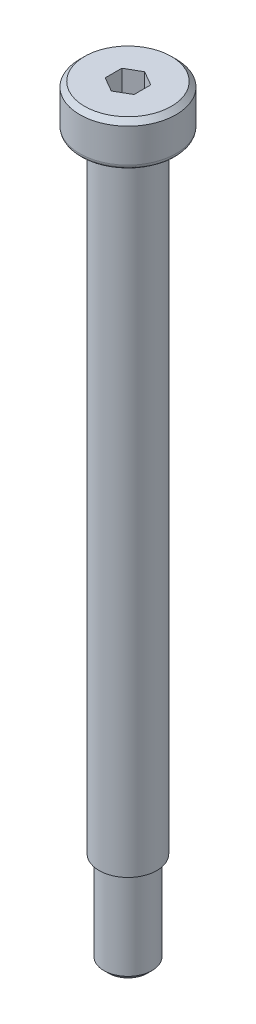
ISO-10303-21;
HEADER;
FILE_DESCRIPTION(('STEP AP214'),'2;1');
FILE_NAME('part.step','',(''),(''),'','','');
FILE_SCHEMA(('AUTOMOTIVE_DESIGN { 1 0 10303 214 1 1 1 1 }'));
ENDSEC;
DATA;
#1=APPLICATION_CONTEXT('core data for automotive mechanical design processes');
#2=APPLICATION_PROTOCOL_DEFINITION('international standard','automotive_design',2000,#1);
#3=PRODUCT_CONTEXT('',#1,'mechanical');
#4=PRODUCT('Part','Part','',(#3));
#5=PRODUCT_RELATED_PRODUCT_CATEGORY('part','',(#4));
#6=PRODUCT_DEFINITION_FORMATION('','',#4);
#7=PRODUCT_DEFINITION_CONTEXT('part definition',#1,'design');
#8=PRODUCT_DEFINITION('design','',#6,#7);
#9=PRODUCT_DEFINITION_SHAPE('','',#8);
#10=(LENGTH_UNIT() NAMED_UNIT(*) SI_UNIT(.MILLI.,.METRE.));
#11=(NAMED_UNIT(*) PLANE_ANGLE_UNIT() SI_UNIT($,.RADIAN.));
#12=(NAMED_UNIT(*) SI_UNIT($,.STERADIAN.) SOLID_ANGLE_UNIT());
#13=UNCERTAINTY_MEASURE_WITH_UNIT(LENGTH_MEASURE(1.E-05),#10,'distance_accuracy_value','');
#14=(GEOMETRIC_REPRESENTATION_CONTEXT(3) GLOBAL_UNCERTAINTY_ASSIGNED_CONTEXT((#13)) GLOBAL_UNIT_ASSIGNED_CONTEXT((#10,
#11,#12)) REPRESENTATION_CONTEXT('',''));
#15=CARTESIAN_POINT('',(0.,0.,0.));
#16=DIRECTION('',(0.,0.,1.));
#17=DIRECTION('',(1.,0.,0.));
#18=AXIS2_PLACEMENT_3D('',#15,#16,#17);
#19=CARTESIAN_POINT('',(0.,0.,0.));
#20=DIRECTION('',(0.,-1.,0.));
#21=DIRECTION('',(1.,0.,0.));
#22=AXIS2_PLACEMENT_3D('',#19,#20,#21);
#23=PLANE('',#22);
#24=CARTESIAN_POINT('',(0.,0.,0.));
#25=DIRECTION('',(0.,-1.,0.));
#26=DIRECTION('',(1.,0.,0.));
#27=AXIS2_PLACEMENT_3D('',#24,#25,#26);
#28=CIRCLE('',#27,4.50000000000001);
#29=CARTESIAN_POINT('',(4.50000000000001,0.,0.));
#30=VERTEX_POINT('',#29);
#31=EDGE_CURVE('E165',#30,#30,#28,.F.);
#32=ORIENTED_EDGE('',*,*,#31,.T.);
#33=EDGE_LOOP('',(#32));
#34=FACE_BOUND('',#33,.T.);
#35=DIRECTION('',(0.866025403784439,0.,-0.5));
#36=VECTOR('',#35,1.);
#37=CARTESIAN_POINT('',(0.,0.,1.73205080756888));
#38=LINE('',#37,#36);
#39=CARTESIAN_POINT('',(0.,0.,1.73205080756888));
#40=VERTEX_POINT('',#39);
#41=CARTESIAN_POINT('',(1.5,0.,0.866025403784439));
#42=VERTEX_POINT('',#41);
#43=EDGE_CURVE('E132',#40,#42,#38,.T.);
#44=ORIENTED_EDGE('',*,*,#43,.F.);
#45=DIRECTION('',(0.866025403784438,0.,0.5));
#46=VECTOR('',#45,1.);
#47=CARTESIAN_POINT('',(-1.5,0.,0.866025403784439));
#48=LINE('',#47,#46);
#49=CARTESIAN_POINT('',(-1.5,0.,0.866025403784439));
#50=VERTEX_POINT('',#49);
#51=EDGE_CURVE('E58',#50,#40,#48,.T.);
#52=ORIENTED_EDGE('',*,*,#51,.F.);
#53=DIRECTION('',(0.,0.,1.));
#54=VECTOR('',#53,1.);
#55=CARTESIAN_POINT('',(-1.5,0.,-0.866025403784439));
#56=LINE('',#55,#54);
#57=CARTESIAN_POINT('',(-1.5,0.,-0.866025403784439));
#58=VERTEX_POINT('',#57);
#59=EDGE_CURVE('E141',#58,#50,#56,.T.);
#60=ORIENTED_EDGE('',*,*,#59,.F.);
#61=DIRECTION('',(-0.866025403784439,0.,0.5));
#62=VECTOR('',#61,1.);
#63=CARTESIAN_POINT('',(0.,0.,-1.73205080756888));
#64=LINE('',#63,#62);
#65=CARTESIAN_POINT('',(0.,0.,-1.73205080756888));
#66=VERTEX_POINT('',#65);
#67=EDGE_CURVE('E139',#66,#58,#64,.T.);
#68=ORIENTED_EDGE('',*,*,#67,.F.);
#69=DIRECTION('',(-0.866025403784439,0.,-0.5));
#70=VECTOR('',#69,1.);
#71=CARTESIAN_POINT('',(1.5,0.,-0.866025403784439));
#72=LINE('',#71,#70);
#73=CARTESIAN_POINT('',(1.5,0.,-0.866025403784439));
#74=VERTEX_POINT('',#73);
#75=EDGE_CURVE('E106',#74,#66,#72,.T.);
#76=ORIENTED_EDGE('',*,*,#75,.F.);
#77=DIRECTION('',(0.,0.,-1.));
#78=VECTOR('',#77,1.);
#79=CARTESIAN_POINT('',(1.5,0.,0.866025403784439));
#80=LINE('',#79,#78);
#81=EDGE_CURVE('E135',#42,#74,#80,.T.);
#82=ORIENTED_EDGE('',*,*,#81,.F.);
#83=EDGE_LOOP('',(#44,#52,#60,#68,#76,#82));
#84=FACE_BOUND('',#83,.T.);
#85=ADVANCED_FACE('F42',(#34,#84),#23,.F.);
#86=CARTESIAN_POINT('',(0.,5.,0.));
#87=DIRECTION('',(0.,1.,0.));
#88=DIRECTION('',(-1.,0.,0.));
#89=AXIS2_PLACEMENT_3D('',#86,#87,#88);
#90=CYLINDRICAL_SURFACE('',#89,5.);
#91=CARTESIAN_POINT('',(0.,-4.,0.));
#92=DIRECTION('',(0.,1.,0.));
#93=DIRECTION('',(-1.,0.,0.));
#94=AXIS2_PLACEMENT_3D('',#91,#92,#93);
#95=CIRCLE('',#94,5.);
#96=CARTESIAN_POINT('',(-5.,-4.00000000000001,0.));
#97=VERTEX_POINT('',#96);
#98=EDGE_CURVE('E171',#97,#97,#95,.T.);
#99=ORIENTED_EDGE('',*,*,#98,.T.);
#100=EDGE_LOOP('',(#99));
#101=FACE_BOUND('',#100,.T.);
#102=CARTESIAN_POINT('',(0.,-0.5,0.));
#103=DIRECTION('',(0.,-1.,0.));
#104=DIRECTION('',(1.,0.,0.));
#105=AXIS2_PLACEMENT_3D('',#102,#103,#104);
#106=CIRCLE('',#105,5.);
#107=CARTESIAN_POINT('',(5.,-0.499999999999999,0.));
#108=VERTEX_POINT('',#107);
#109=EDGE_CURVE('E168',#108,#108,#106,.T.);
#110=ORIENTED_EDGE('',*,*,#109,.T.);
#111=EDGE_LOOP('',(#110));
#112=FACE_BOUND('',#111,.T.);
#113=ADVANCED_FACE('F193',(#101,#112),#90,.T.);
#114=CARTESIAN_POINT('',(5.,-4.50000000000001,0.));
#115=DIRECTION('',(0.,1.,0.));
#116=DIRECTION('',(-1.,0.,0.));
#117=AXIS2_PLACEMENT_3D('',#114,#115,#116);
#118=PLANE('',#117);
#119=CARTESIAN_POINT('',(0.,-4.50000000000001,0.));
#120=DIRECTION('',(0.,1.,0.));
#121=DIRECTION('',(-1.,0.,0.));
#122=AXIS2_PLACEMENT_3D('',#119,#120,#121);
#123=CIRCLE('',#122,4.5);
#124=CARTESIAN_POINT('',(-4.5,-4.50000000000001,0.));
#125=VERTEX_POINT('',#124);
#126=EDGE_CURVE('E174',#125,#125,#123,.F.);
#127=ORIENTED_EDGE('',*,*,#126,.T.);
#128=EDGE_LOOP('',(#127));
#129=FACE_BOUND('',#128,.T.);
#130=CARTESIAN_POINT('',(0.,-4.50000000000001,0.));
#131=DIRECTION('',(0.,1.,0.));
#132=DIRECTION('',(-1.,0.,0.));
#133=AXIS2_PLACEMENT_3D('',#130,#131,#132);
#134=CIRCLE('',#133,2.75);
#135=CARTESIAN_POINT('',(-2.75,-4.50000000000001,0.));
#136=VERTEX_POINT('',#135);
#137=EDGE_CURVE('E162',#136,#136,#134,.T.);
#138=ORIENTED_EDGE('',*,*,#137,.T.);
#139=EDGE_LOOP('',(#138));
#140=FACE_BOUND('',#139,.T.);
#141=ADVANCED_FACE('F201',(#129,#140),#118,.F.);
#142=CARTESIAN_POINT('',(0.,5.,0.));
#143=DIRECTION('',(0.,1.,0.));
#144=DIRECTION('',(-1.,0.,0.));
#145=AXIS2_PLACEMENT_3D('',#142,#143,#144);
#146=CYLINDRICAL_SURFACE('',#145,2.75);
#147=ORIENTED_EDGE('',*,*,#137,.F.);
#148=EDGE_LOOP('',(#147));
#149=FACE_BOUND('',#148,.T.);
#150=CARTESIAN_POINT('',(0.,-4.75000000000001,0.));
#151=DIRECTION('',(0.,1.,0.));
#152=DIRECTION('',(-1.,0.,0.));
#153=AXIS2_PLACEMENT_3D('',#150,#151,#152);
#154=CIRCLE('',#153,2.75);
#155=CARTESIAN_POINT('',(-2.75,-4.75000000000001,0.));
#156=VERTEX_POINT('',#155);
#157=EDGE_CURVE('E159',#156,#156,#154,.T.);
#158=ORIENTED_EDGE('',*,*,#157,.T.);
#159=EDGE_LOOP('',(#158));
#160=FACE_BOUND('',#159,.T.);
#161=ADVANCED_FACE('F255',(#149,#160),#146,.T.);
#162=CARTESIAN_POINT('',(2.75,-4.75000000000001,0.));
#163=DIRECTION('',(0.,-1.,0.));
#164=DIRECTION('',(1.,0.,0.));
#165=AXIS2_PLACEMENT_3D('',#162,#163,#164);
#166=PLANE('',#165);
#167=ORIENTED_EDGE('',*,*,#157,.F.);
#168=EDGE_LOOP('',(#167));
#169=FACE_BOUND('',#168,.T.);
#170=CARTESIAN_POINT('',(0.,-4.75000000000001,0.));
#171=DIRECTION('',(0.,1.,0.));
#172=DIRECTION('',(-1.,0.,0.));
#173=AXIS2_PLACEMENT_3D('',#170,#171,#172);
#174=CIRCLE('',#173,3.);
#175=CARTESIAN_POINT('',(-3.,-4.75000000000001,0.));
#176=VERTEX_POINT('',#175);
#177=EDGE_CURVE('E156',#176,#176,#174,.T.);
#178=ORIENTED_EDGE('',*,*,#177,.T.);
#179=EDGE_LOOP('',(#178));
#180=FACE_BOUND('',#179,.T.);
#181=ADVANCED_FACE('F251',(#169,#180),#166,.F.);
#182=CARTESIAN_POINT('',(0.,5.,0.));
#183=DIRECTION('',(0.,1.,0.));
#184=DIRECTION('',(-1.,0.,0.));
#185=AXIS2_PLACEMENT_3D('',#182,#183,#184);
#186=CYLINDRICAL_SURFACE('',#185,3.00000000000001);
#187=ORIENTED_EDGE('',*,*,#177,.F.);
#188=EDGE_LOOP('',(#187));
#189=FACE_BOUND('',#188,.T.);
#190=CARTESIAN_POINT('',(0.,-69.5,0.));
#191=DIRECTION('',(0.,1.,0.));
#192=DIRECTION('',(-1.,0.,0.));
#193=AXIS2_PLACEMENT_3D('',#190,#191,#192);
#194=CIRCLE('',#193,3.00000000000001);
#195=CARTESIAN_POINT('',(-3.,-69.5,0.));
#196=VERTEX_POINT('',#195);
#197=EDGE_CURVE('E153',#196,#196,#194,.T.);
#198=ORIENTED_EDGE('',*,*,#197,.T.);
#199=EDGE_LOOP('',(#198));
#200=FACE_BOUND('',#199,.T.);
#201=ADVANCED_FACE('F247',(#189,#200),#186,.T.);
#202=CARTESIAN_POINT('',(3.00000000000002,-69.5,0.));
#203=DIRECTION('',(0.,1.,0.));
#204=DIRECTION('',(-1.,0.,0.));
#205=AXIS2_PLACEMENT_3D('',#202,#203,#204);
#206=PLANE('',#205);
#207=ORIENTED_EDGE('',*,*,#197,.F.);
#208=EDGE_LOOP('',(#207));
#209=FACE_BOUND('',#208,.T.);
#210=CARTESIAN_POINT('',(0.,-69.5,0.));
#211=DIRECTION('',(0.,1.,0.));
#212=DIRECTION('',(-1.,0.,0.));
#213=AXIS2_PLACEMENT_3D('',#210,#211,#212);
#214=CIRCLE('',#213,2.5);
#215=CARTESIAN_POINT('',(-2.49999999999999,-69.5,0.));
#216=VERTEX_POINT('',#215);
#217=EDGE_CURVE('E145',#216,#216,#214,.T.);
#218=ORIENTED_EDGE('',*,*,#217,.T.);
#219=EDGE_LOOP('',(#218));
#220=FACE_BOUND('',#219,.T.);
#221=ADVANCED_FACE('F244',(#209,#220),#206,.F.);
#222=CARTESIAN_POINT('',(0.,5.,0.));
#223=DIRECTION('',(0.,1.,0.));
#224=DIRECTION('',(-1.,0.,0.));
#225=AXIS2_PLACEMENT_3D('',#222,#223,#224);
#226=CYLINDRICAL_SURFACE('',#225,2.5);
#227=CARTESIAN_POINT('',(0.,-78.75,0.));
#228=DIRECTION('',(0.,1.,0.));
#229=DIRECTION('',(-1.,0.,0.));
#230=AXIS2_PLACEMENT_3D('',#227,#228,#229);
#231=CIRCLE('',#230,2.5);
#232=CARTESIAN_POINT('',(-2.49999999999999,-78.75,0.));
#233=VERTEX_POINT('',#232);
#234=EDGE_CURVE('E51',#233,#233,#231,.T.);
#235=ORIENTED_EDGE('',*,*,#234,.T.);
#236=EDGE_LOOP('',(#235));
#237=FACE_BOUND('',#236,.T.);
#238=ORIENTED_EDGE('',*,*,#217,.F.);
#239=EDGE_LOOP('',(#238));
#240=FACE_BOUND('',#239,.T.);
#241=ADVANCED_FACE('F179',(#237,#240),#226,.T.);
#242=CARTESIAN_POINT('',(2.50000000000001,-79.25,0.));
#243=DIRECTION('',(0.,1.,0.));
#244=DIRECTION('',(-1.,0.,0.));
#245=AXIS2_PLACEMENT_3D('',#242,#243,#244);
#246=PLANE('',#245);
#247=CARTESIAN_POINT('',(0.,-79.25,0.));
#248=DIRECTION('',(0.,1.,0.));
#249=DIRECTION('',(-1.,0.,0.));
#250=AXIS2_PLACEMENT_3D('',#247,#248,#249);
#251=CIRCLE('',#250,2.00000000000001);
#252=CARTESIAN_POINT('',(-2.,-79.25,0.));
#253=VERTEX_POINT('',#252);
#254=EDGE_CURVE('E11',#253,#253,#251,.F.);
#255=ORIENTED_EDGE('',*,*,#254,.T.);
#256=EDGE_LOOP('',(#255));
#257=FACE_BOUND('',#256,.T.);
#258=ADVANCED_FACE('F239',(#257),#246,.F.);
#259=CARTESIAN_POINT('',(-1.5,-2.5,0.866025403784439));
#260=DIRECTION('',(-0.5,0.,0.866025403784439));
#261=DIRECTION('',(0.866025403784439,0.,0.5));
#262=AXIS2_PLACEMENT_3D('',#259,#260,#261);
#263=PLANE('',#262);
#264=ORIENTED_EDGE('',*,*,#51,.T.);
#265=DIRECTION('',(0.,1.,0.));
#266=VECTOR('',#265,1.);
#267=CARTESIAN_POINT('',(0.,-2.5,1.73205080756888));
#268=LINE('',#267,#266);
#269=CARTESIAN_POINT('',(0.,-2.5,1.73205080756888));
#270=VERTEX_POINT('',#269);
#271=EDGE_CURVE('E88',#270,#40,#268,.T.);
#272=ORIENTED_EDGE('',*,*,#271,.F.);
#273=DIRECTION('',(0.866025403784438,0.,0.5));
#274=VECTOR('',#273,1.);
#275=CARTESIAN_POINT('',(-1.5,-2.5,0.866025403784439));
#276=LINE('',#275,#274);
#277=CARTESIAN_POINT('',(-1.5,-2.5,0.866025403784439));
#278=VERTEX_POINT('',#277);
#279=EDGE_CURVE('E143',#278,#270,#276,.T.);
#280=ORIENTED_EDGE('',*,*,#279,.F.);
#281=DIRECTION('',(0.,1.,0.));
#282=VECTOR('',#281,1.);
#283=CARTESIAN_POINT('',(-1.5,-2.5,0.866025403784439));
#284=LINE('',#283,#282);
#285=EDGE_CURVE('E66',#278,#50,#284,.T.);
#286=ORIENTED_EDGE('',*,*,#285,.T.);
#287=EDGE_LOOP('',(#264,#272,#280,#286));
#288=FACE_BOUND('',#287,.T.);
#289=ADVANCED_FACE('F229',(#288),#263,.F.);
#290=CARTESIAN_POINT('',(-1.5,-2.5,-0.866025403784439));
#291=DIRECTION('',(-1.,0.,0.));
#292=DIRECTION('',(0.,0.,1.));
#293=AXIS2_PLACEMENT_3D('',#290,#291,#292);
#294=PLANE('',#293);
#295=ORIENTED_EDGE('',*,*,#59,.T.);
#296=ORIENTED_EDGE('',*,*,#285,.F.);
#297=DIRECTION('',(0.,0.,1.));
#298=VECTOR('',#297,1.);
#299=CARTESIAN_POINT('',(-1.5,-2.5,-0.866025403784439));
#300=LINE('',#299,#298);
#301=CARTESIAN_POINT('',(-1.5,-2.5,-0.866025403784439));
#302=VERTEX_POINT('',#301);
#303=EDGE_CURVE('E118',#302,#278,#300,.T.);
#304=ORIENTED_EDGE('',*,*,#303,.F.);
#305=DIRECTION('',(0.,1.,0.));
#306=VECTOR('',#305,1.);
#307=CARTESIAN_POINT('',(-1.5,-2.5,-0.866025403784439));
#308=LINE('',#307,#306);
#309=EDGE_CURVE('E110',#302,#58,#308,.T.);
#310=ORIENTED_EDGE('',*,*,#309,.T.);
#311=EDGE_LOOP('',(#295,#296,#304,#310));
#312=FACE_BOUND('',#311,.T.);
#313=ADVANCED_FACE('F226',(#312),#294,.F.);
#314=CARTESIAN_POINT('',(0.,-2.5,-1.73205080756888));
#315=DIRECTION('',(-0.5,0.,-0.866025403784439));
#316=DIRECTION('',(-0.866025403784439,0.,0.5));
#317=AXIS2_PLACEMENT_3D('',#314,#315,#316);
#318=PLANE('',#317);
#319=ORIENTED_EDGE('',*,*,#67,.T.);
#320=ORIENTED_EDGE('',*,*,#309,.F.);
#321=DIRECTION('',(-0.866025403784439,0.,0.5));
#322=VECTOR('',#321,1.);
#323=CARTESIAN_POINT('',(0.,-2.5,-1.73205080756888));
#324=LINE('',#323,#322);
#325=CARTESIAN_POINT('',(0.,-2.5,-1.73205080756888));
#326=VERTEX_POINT('',#325);
#327=EDGE_CURVE('E114',#326,#302,#324,.T.);
#328=ORIENTED_EDGE('',*,*,#327,.F.);
#329=DIRECTION('',(0.,1.,0.));
#330=VECTOR('',#329,1.);
#331=CARTESIAN_POINT('',(0.,-2.5,-1.73205080756888));
#332=LINE('',#331,#330);
#333=EDGE_CURVE('E99',#326,#66,#332,.T.);
#334=ORIENTED_EDGE('',*,*,#333,.T.);
#335=EDGE_LOOP('',(#319,#320,#328,#334));
#336=FACE_BOUND('',#335,.T.);
#337=ADVANCED_FACE('F115',(#336),#318,.F.);
#338=CARTESIAN_POINT('',(1.5,-2.5,-0.866025403784439));
#339=DIRECTION('',(0.5,0.,-0.866025403784439));
#340=DIRECTION('',(-0.866025403784439,0.,-0.5));
#341=AXIS2_PLACEMENT_3D('',#338,#339,#340);
#342=PLANE('',#341);
#343=ORIENTED_EDGE('',*,*,#75,.T.);
#344=ORIENTED_EDGE('',*,*,#333,.F.);
#345=DIRECTION('',(-0.866025403784439,0.,-0.5));
#346=VECTOR('',#345,1.);
#347=CARTESIAN_POINT('',(1.5,-2.5,-0.866025403784439));
#348=LINE('',#347,#346);
#349=CARTESIAN_POINT('',(1.5,-2.5,-0.866025403784439));
#350=VERTEX_POINT('',#349);
#351=EDGE_CURVE('E103',#350,#326,#348,.T.);
#352=ORIENTED_EDGE('',*,*,#351,.F.);
#353=DIRECTION('',(0.,1.,0.));
#354=VECTOR('',#353,1.);
#355=CARTESIAN_POINT('',(1.5,-2.5,-0.866025403784439));
#356=LINE('',#355,#354);
#357=EDGE_CURVE('E111',#350,#74,#356,.T.);
#358=ORIENTED_EDGE('',*,*,#357,.T.);
#359=EDGE_LOOP('',(#343,#344,#352,#358));
#360=FACE_BOUND('',#359,.T.);
#361=ADVANCED_FACE('F101',(#360),#342,.F.);
#362=CARTESIAN_POINT('',(1.5,-2.5,0.866025403784439));
#363=DIRECTION('',(1.,0.,0.));
#364=DIRECTION('',(0.,1.,0.));
#365=AXIS2_PLACEMENT_3D('',#362,#363,#364);
#366=PLANE('',#365);
#367=ORIENTED_EDGE('',*,*,#81,.T.);
#368=ORIENTED_EDGE('',*,*,#357,.F.);
#369=DIRECTION('',(0.,0.,-1.));
#370=VECTOR('',#369,1.);
#371=CARTESIAN_POINT('',(1.5,-2.5,0.866025403784439));
#372=LINE('',#371,#370);
#373=CARTESIAN_POINT('',(1.5,-2.5,0.866025403784439));
#374=VERTEX_POINT('',#373);
#375=EDGE_CURVE('E124',#374,#350,#372,.T.);
#376=ORIENTED_EDGE('',*,*,#375,.F.);
#377=DIRECTION('',(0.,1.,0.));
#378=VECTOR('',#377,1.);
#379=CARTESIAN_POINT('',(1.5,-2.5,0.866025403784439));
#380=LINE('',#379,#378);
#381=EDGE_CURVE('E148',#374,#42,#380,.T.);
#382=ORIENTED_EDGE('',*,*,#381,.T.);
#383=EDGE_LOOP('',(#367,#368,#376,#382));
#384=FACE_BOUND('',#383,.T.);
#385=ADVANCED_FACE('F222',(#384),#366,.F.);
#386=CARTESIAN_POINT('',(0.,-2.5,1.73205080756888));
#387=DIRECTION('',(0.5,0.,0.866025403784439));
#388=DIRECTION('',(0.866025403784439,0.,-0.5));
#389=AXIS2_PLACEMENT_3D('',#386,#387,#388);
#390=PLANE('',#389);
#391=ORIENTED_EDGE('',*,*,#43,.T.);
#392=ORIENTED_EDGE('',*,*,#381,.F.);
#393=DIRECTION('',(0.866025403784439,0.,-0.5));
#394=VECTOR('',#393,1.);
#395=CARTESIAN_POINT('',(0.,-2.5,1.73205080756888));
#396=LINE('',#395,#394);
#397=EDGE_CURVE('E126',#270,#374,#396,.T.);
#398=ORIENTED_EDGE('',*,*,#397,.F.);
#399=ORIENTED_EDGE('',*,*,#271,.T.);
#400=EDGE_LOOP('',(#391,#392,#398,#399));
#401=FACE_BOUND('',#400,.T.);
#402=ADVANCED_FACE('F213',(#401),#390,.F.);
#403=CARTESIAN_POINT('',(0.,-2.5,0.));
#404=DIRECTION('',(0.,1.,0.));
#405=DIRECTION('',(-1.,0.,0.));
#406=AXIS2_PLACEMENT_3D('',#403,#404,#405);
#407=PLANE('',#406);
#408=ORIENTED_EDGE('',*,*,#279,.T.);
#409=ORIENTED_EDGE('',*,*,#397,.T.);
#410=ORIENTED_EDGE('',*,*,#375,.T.);
#411=ORIENTED_EDGE('',*,*,#351,.T.);
#412=ORIENTED_EDGE('',*,*,#327,.T.);
#413=ORIENTED_EDGE('',*,*,#303,.T.);
#414=EDGE_LOOP('',(#408,#409,#410,#411,#412,#413));
#415=FACE_BOUND('',#414,.T.);
#416=ADVANCED_FACE('F121',(#415),#407,.T.);
#417=CARTESIAN_POINT('',(0.,0.,0.));
#418=DIRECTION('',(0.,-1.,0.));
#419=DIRECTION('',(1.,0.,0.));
#420=AXIS2_PLACEMENT_3D('',#417,#418,#419);
#421=CONICAL_SURFACE('',#420,4.50000000000001,0.785398163397438);
#422=ORIENTED_EDGE('',*,*,#109,.F.);
#423=EDGE_LOOP('',(#422));
#424=FACE_BOUND('',#423,.T.);
#425=ORIENTED_EDGE('',*,*,#31,.F.);
#426=EDGE_LOOP('',(#425));
#427=FACE_BOUND('',#426,.T.);
#428=ADVANCED_FACE('F189',(#424,#427),#421,.T.);
#429=CARTESIAN_POINT('',(0.,-4.,0.));
#430=DIRECTION('',(0.,1.,0.));
#431=DIRECTION('',(-1.,0.,0.));
#432=AXIS2_PLACEMENT_3D('',#429,#430,#431);
#433=TOROIDAL_SURFACE('',#432,4.5,0.5);
#434=ORIENTED_EDGE('',*,*,#126,.F.);
#435=EDGE_LOOP('',(#434));
#436=FACE_BOUND('',#435,.T.);
#437=ORIENTED_EDGE('',*,*,#98,.F.);
#438=EDGE_LOOP('',(#437));
#439=FACE_BOUND('',#438,.T.);
#440=ADVANCED_FACE('F183',(#436,#439),#433,.T.);
#441=CARTESIAN_POINT('',(0.,-78.75,0.));
#442=DIRECTION('',(0.,1.,0.));
#443=DIRECTION('',(-1.,0.,0.));
#444=AXIS2_PLACEMENT_3D('',#441,#442,#443);
#445=CONICAL_SURFACE('',#444,2.5,0.78539816339744);
#446=ORIENTED_EDGE('',*,*,#254,.F.);
#447=EDGE_LOOP('',(#446));
#448=FACE_BOUND('',#447,.T.);
#449=ORIENTED_EDGE('',*,*,#234,.F.);
#450=EDGE_LOOP('',(#449));
#451=FACE_BOUND('',#450,.T.);
#452=ADVANCED_FACE('F45',(#448,#451),#445,.T.);
#453=CLOSED_SHELL('',(#85,#113,#141,#161,#181,#201,#221,#241,#258,#289,#313,#337,#361,#385,#402,
#416,#428,#440,#452));
#454=MANIFOLD_SOLID_BREP('B2',#453);
#455=ADVANCED_BREP_SHAPE_REPRESENTATION('',(#18,#454),#14);
#456=SHAPE_DEFINITION_REPRESENTATION(#9,#455);
ENDSEC;
END-ISO-10303-21;
